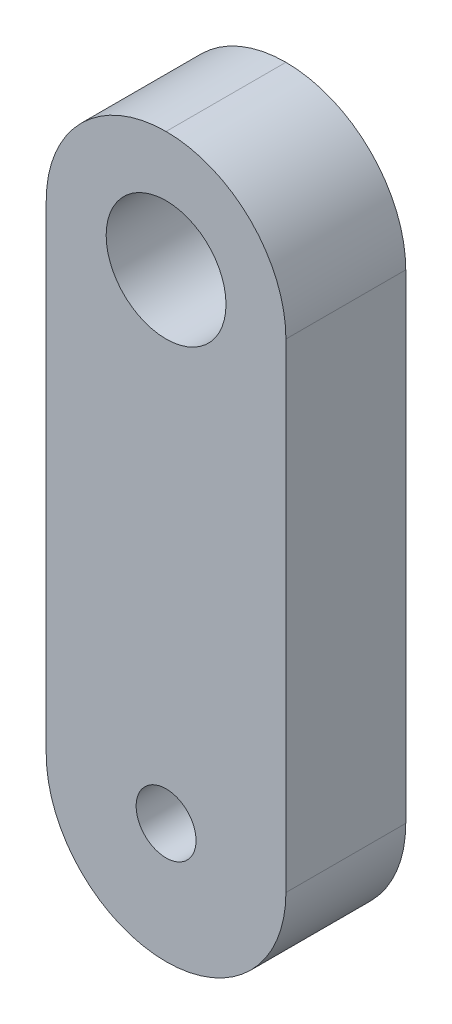
ISO-10303-21;
HEADER;
FILE_DESCRIPTION(('STEP AP214'),'2;1');
FILE_NAME('part.step','',(''),(''),'','','');
FILE_SCHEMA(('AUTOMOTIVE_DESIGN { 1 0 10303 214 1 1 1 1 }'));
ENDSEC;
DATA;
#1=APPLICATION_CONTEXT('core data for automotive mechanical design processes');
#2=APPLICATION_PROTOCOL_DEFINITION('international standard','automotive_design',2000,#1);
#3=PRODUCT_CONTEXT('',#1,'mechanical');
#4=PRODUCT('Part','Part','',(#3));
#5=PRODUCT_RELATED_PRODUCT_CATEGORY('part','',(#4));
#6=PRODUCT_DEFINITION_FORMATION('','',#4);
#7=PRODUCT_DEFINITION_CONTEXT('part definition',#1,'design');
#8=PRODUCT_DEFINITION('design','',#6,#7);
#9=PRODUCT_DEFINITION_SHAPE('','',#8);
#10=(LENGTH_UNIT() NAMED_UNIT(*) SI_UNIT(.MILLI.,.METRE.));
#11=(NAMED_UNIT(*) PLANE_ANGLE_UNIT() SI_UNIT($,.RADIAN.));
#12=(NAMED_UNIT(*) SI_UNIT($,.STERADIAN.) SOLID_ANGLE_UNIT());
#13=UNCERTAINTY_MEASURE_WITH_UNIT(LENGTH_MEASURE(1.E-05),#10,'distance_accuracy_value','');
#14=(GEOMETRIC_REPRESENTATION_CONTEXT(3) GLOBAL_UNCERTAINTY_ASSIGNED_CONTEXT((#13)) GLOBAL_UNIT_ASSIGNED_CONTEXT((#10,
#11,#12)) REPRESENTATION_CONTEXT('',''));
#15=CARTESIAN_POINT('',(0.,0.,0.));
#16=DIRECTION('',(0.,0.,1.));
#17=DIRECTION('',(1.,0.,0.));
#18=AXIS2_PLACEMENT_3D('',#15,#16,#17);
#19=CARTESIAN_POINT('',(0.,0.,10.));
#20=DIRECTION('',(1.,0.,0.));
#21=DIRECTION('',(0.,0.,-1.));
#22=AXIS2_PLACEMENT_3D('',#19,#20,#21);
#23=PLANE('',#22);
#24=DIRECTION('',(0.,-1.,0.));
#25=VECTOR('',#24,1.);
#26=CARTESIAN_POINT('',(0.,0.,0.));
#27=LINE('',#26,#25);
#28=CARTESIAN_POINT('',(0.,50.,0.));
#29=VERTEX_POINT('',#28);
#30=CARTESIAN_POINT('',(0.,10.,0.));
#31=VERTEX_POINT('',#30);
#32=EDGE_CURVE('E103',#29,#31,#27,.T.);
#33=ORIENTED_EDGE('',*,*,#32,.T.);
#34=DIRECTION('',(0.,0.,-1.));
#35=VECTOR('',#34,1.);
#36=CARTESIAN_POINT('',(0.,10.,10.));
#37=LINE('',#36,#35);
#38=CARTESIAN_POINT('',(0.,10.,10.));
#39=VERTEX_POINT('',#38);
#40=EDGE_CURVE('E107',#31,#39,#37,.F.);
#41=ORIENTED_EDGE('',*,*,#40,.T.);
#42=DIRECTION('',(0.,-1.,0.));
#43=VECTOR('',#42,1.);
#44=CARTESIAN_POINT('',(0.,0.,10.));
#45=LINE('',#44,#43);
#46=CARTESIAN_POINT('',(0.,50.,10.));
#47=VERTEX_POINT('',#46);
#48=EDGE_CURVE('E106',#47,#39,#45,.T.);
#49=ORIENTED_EDGE('',*,*,#48,.F.);
#50=DIRECTION('',(0.,0.,-1.));
#51=VECTOR('',#50,1.);
#52=CARTESIAN_POINT('',(0.,50.,10.));
#53=LINE('',#52,#51);
#54=EDGE_CURVE('E92',#47,#29,#53,.T.);
#55=ORIENTED_EDGE('',*,*,#54,.T.);
#56=EDGE_LOOP('',(#33,#41,#49,#55));
#57=FACE_BOUND('',#56,.T.);
#58=ADVANCED_FACE('F33',(#57),#23,.F.);
#59=CARTESIAN_POINT('',(20.,0.,10.));
#60=DIRECTION('',(-1.,0.,0.));
#61=DIRECTION('',(0.,0.,1.));
#62=AXIS2_PLACEMENT_3D('',#59,#60,#61);
#63=PLANE('',#62);
#64=DIRECTION('',(0.,1.,0.));
#65=VECTOR('',#64,1.);
#66=CARTESIAN_POINT('',(20.,0.,10.));
#67=LINE('',#66,#65);
#68=CARTESIAN_POINT('',(20.,10.,10.));
#69=VERTEX_POINT('',#68);
#70=CARTESIAN_POINT('',(20.,50.,10.));
#71=VERTEX_POINT('',#70);
#72=EDGE_CURVE('E120',#69,#71,#67,.T.);
#73=ORIENTED_EDGE('',*,*,#72,.F.);
#74=DIRECTION('',(0.,0.,-1.));
#75=VECTOR('',#74,1.);
#76=CARTESIAN_POINT('',(20.,10.,10.));
#77=LINE('',#76,#75);
#78=CARTESIAN_POINT('',(20.,10.,0.));
#79=VERTEX_POINT('',#78);
#80=EDGE_CURVE('E11',#69,#79,#77,.T.);
#81=ORIENTED_EDGE('',*,*,#80,.T.);
#82=DIRECTION('',(0.,1.,0.));
#83=VECTOR('',#82,1.);
#84=CARTESIAN_POINT('',(20.,0.,0.));
#85=LINE('',#84,#83);
#86=CARTESIAN_POINT('',(20.,50.,0.));
#87=VERTEX_POINT('',#86);
#88=EDGE_CURVE('E112',#79,#87,#85,.T.);
#89=ORIENTED_EDGE('',*,*,#88,.T.);
#90=DIRECTION('',(0.,0.,-1.));
#91=VECTOR('',#90,1.);
#92=CARTESIAN_POINT('',(20.,50.,10.));
#93=LINE('',#92,#91);
#94=EDGE_CURVE('E42',#87,#71,#93,.F.);
#95=ORIENTED_EDGE('',*,*,#94,.T.);
#96=EDGE_LOOP('',(#73,#81,#89,#95));
#97=FACE_BOUND('',#96,.T.);
#98=ADVANCED_FACE('F154',(#97),#63,.F.);
#99=CARTESIAN_POINT('',(0.,0.,10.));
#100=DIRECTION('',(0.,0.,-1.));
#101=DIRECTION('',(-1.,0.,0.));
#102=AXIS2_PLACEMENT_3D('',#99,#100,#101);
#103=PLANE('',#102);
#104=CARTESIAN_POINT('',(10.,50.,10.));
#105=DIRECTION('',(0.,0.,-1.));
#106=DIRECTION('',(-1.,0.,0.));
#107=AXIS2_PLACEMENT_3D('',#104,#105,#106);
#108=CIRCLE('',#107,5.);
#109=CARTESIAN_POINT('',(5.00000000000001,50.,10.));
#110=VERTEX_POINT('',#109);
#111=EDGE_CURVE('E113',#110,#110,#108,.T.);
#112=ORIENTED_EDGE('',*,*,#111,.T.);
#113=EDGE_LOOP('',(#112));
#114=FACE_BOUND('',#113,.T.);
#115=CARTESIAN_POINT('',(10.,10.,10.));
#116=DIRECTION('',(0.,0.,-1.));
#117=DIRECTION('',(-1.,0.,0.));
#118=AXIS2_PLACEMENT_3D('',#115,#116,#117);
#119=CIRCLE('',#118,2.5);
#120=CARTESIAN_POINT('',(7.50000000000001,10.,10.));
#121=VERTEX_POINT('',#120);
#122=EDGE_CURVE('E117',#121,#121,#119,.T.);
#123=ORIENTED_EDGE('',*,*,#122,.T.);
#124=EDGE_LOOP('',(#123));
#125=FACE_BOUND('',#124,.T.);
#126=ORIENTED_EDGE('',*,*,#48,.T.);
#127=CARTESIAN_POINT('',(10.,10.,10.));
#128=DIRECTION('',(0.,0.,-1.));
#129=DIRECTION('',(-1.,0.,0.));
#130=AXIS2_PLACEMENT_3D('',#127,#128,#129);
#131=CIRCLE('',#130,10.);
#132=CARTESIAN_POINT('',(10.,0.,10.));
#133=VERTEX_POINT('',#132);
#134=EDGE_CURVE('E132',#39,#133,#131,.F.);
#135=ORIENTED_EDGE('',*,*,#134,.T.);
#136=CARTESIAN_POINT('',(10.,10.,10.));
#137=DIRECTION('',(0.,0.,-1.));
#138=DIRECTION('',(-1.,0.,0.));
#139=AXIS2_PLACEMENT_3D('',#136,#137,#138);
#140=CIRCLE('',#139,10.);
#141=EDGE_CURVE('E130',#133,#69,#140,.F.);
#142=ORIENTED_EDGE('',*,*,#141,.T.);
#143=ORIENTED_EDGE('',*,*,#72,.T.);
#144=CARTESIAN_POINT('',(10.,50.,10.));
#145=DIRECTION('',(0.,0.,-1.));
#146=DIRECTION('',(-1.,0.,0.));
#147=AXIS2_PLACEMENT_3D('',#144,#145,#146);
#148=CIRCLE('',#147,10.);
#149=CARTESIAN_POINT('',(10.,60.,10.));
#150=VERTEX_POINT('',#149);
#151=EDGE_CURVE('E50',#71,#150,#148,.F.);
#152=ORIENTED_EDGE('',*,*,#151,.T.);
#153=CARTESIAN_POINT('',(10.,50.,10.));
#154=DIRECTION('',(0.,0.,-1.));
#155=DIRECTION('',(-1.,0.,0.));
#156=AXIS2_PLACEMENT_3D('',#153,#154,#155);
#157=CIRCLE('',#156,10.);
#158=EDGE_CURVE('E128',#150,#47,#157,.F.);
#159=ORIENTED_EDGE('',*,*,#158,.T.);
#160=EDGE_LOOP('',(#126,#135,#142,#143,#152,#159));
#161=FACE_BOUND('',#160,.T.);
#162=ADVANCED_FACE('F148',(#114,#125,#161),#103,.F.);
#163=CARTESIAN_POINT('',(0.,0.,0.));
#164=DIRECTION('',(0.,0.,-1.));
#165=DIRECTION('',(-1.,0.,0.));
#166=AXIS2_PLACEMENT_3D('',#163,#164,#165);
#167=PLANE('',#166);
#168=CARTESIAN_POINT('',(10.,50.,0.));
#169=DIRECTION('',(0.,0.,1.));
#170=DIRECTION('',(1.,0.,0.));
#171=AXIS2_PLACEMENT_3D('',#168,#169,#170);
#172=CIRCLE('',#171,5.);
#173=CARTESIAN_POINT('',(15.,50.,0.));
#174=VERTEX_POINT('',#173);
#175=EDGE_CURVE('E140',#174,#174,#172,.T.);
#176=ORIENTED_EDGE('',*,*,#175,.T.);
#177=EDGE_LOOP('',(#176));
#178=FACE_BOUND('',#177,.T.);
#179=CARTESIAN_POINT('',(10.,10.,0.));
#180=DIRECTION('',(0.,0.,1.));
#181=DIRECTION('',(1.,0.,0.));
#182=AXIS2_PLACEMENT_3D('',#179,#180,#181);
#183=CIRCLE('',#182,2.5);
#184=CARTESIAN_POINT('',(12.5,10.,0.));
#185=VERTEX_POINT('',#184);
#186=EDGE_CURVE('E136',#185,#185,#183,.T.);
#187=ORIENTED_EDGE('',*,*,#186,.T.);
#188=EDGE_LOOP('',(#187));
#189=FACE_BOUND('',#188,.T.);
#190=CARTESIAN_POINT('',(10.,10.,0.));
#191=DIRECTION('',(0.,0.,-1.));
#192=DIRECTION('',(-1.,0.,0.));
#193=AXIS2_PLACEMENT_3D('',#190,#191,#192);
#194=CIRCLE('',#193,10.);
#195=CARTESIAN_POINT('',(10.,0.,0.));
#196=VERTEX_POINT('',#195);
#197=EDGE_CURVE('E96',#79,#196,#194,.T.);
#198=ORIENTED_EDGE('',*,*,#197,.T.);
#199=CARTESIAN_POINT('',(10.,10.,0.));
#200=DIRECTION('',(0.,0.,-1.));
#201=DIRECTION('',(-1.,0.,0.));
#202=AXIS2_PLACEMENT_3D('',#199,#200,#201);
#203=CIRCLE('',#202,10.);
#204=EDGE_CURVE('E108',#196,#31,#203,.T.);
#205=ORIENTED_EDGE('',*,*,#204,.T.);
#206=ORIENTED_EDGE('',*,*,#32,.F.);
#207=CARTESIAN_POINT('',(10.,50.,0.));
#208=DIRECTION('',(0.,0.,-1.));
#209=DIRECTION('',(-1.,0.,0.));
#210=AXIS2_PLACEMENT_3D('',#207,#208,#209);
#211=CIRCLE('',#210,10.);
#212=CARTESIAN_POINT('',(10.,60.,0.));
#213=VERTEX_POINT('',#212);
#214=EDGE_CURVE('E88',#29,#213,#211,.T.);
#215=ORIENTED_EDGE('',*,*,#214,.T.);
#216=CARTESIAN_POINT('',(10.,50.,0.));
#217=DIRECTION('',(0.,0.,-1.));
#218=DIRECTION('',(-1.,0.,0.));
#219=AXIS2_PLACEMENT_3D('',#216,#217,#218);
#220=CIRCLE('',#219,10.);
#221=EDGE_CURVE('E97',#213,#87,#220,.T.);
#222=ORIENTED_EDGE('',*,*,#221,.T.);
#223=ORIENTED_EDGE('',*,*,#88,.F.);
#224=EDGE_LOOP('',(#198,#205,#206,#215,#222,#223));
#225=FACE_BOUND('',#224,.T.);
#226=ADVANCED_FACE('F110',(#178,#189,#225),#167,.T.);
#227=CARTESIAN_POINT('',(10.,10.,0.));
#228=DIRECTION('',(0.,0.,1.));
#229=DIRECTION('',(1.,0.,0.));
#230=AXIS2_PLACEMENT_3D('',#227,#228,#229);
#231=CYLINDRICAL_SURFACE('',#230,2.5);
#232=ORIENTED_EDGE('',*,*,#186,.F.);
#233=EDGE_LOOP('',(#232));
#234=FACE_BOUND('',#233,.T.);
#235=ORIENTED_EDGE('',*,*,#122,.F.);
#236=EDGE_LOOP('',(#235));
#237=FACE_BOUND('',#236,.T.);
#238=ADVANCED_FACE('F175',(#234,#237),#231,.F.);
#239=CARTESIAN_POINT('',(10.,50.,0.));
#240=DIRECTION('',(0.,0.,1.));
#241=DIRECTION('',(1.,0.,0.));
#242=AXIS2_PLACEMENT_3D('',#239,#240,#241);
#243=CYLINDRICAL_SURFACE('',#242,5.);
#244=ORIENTED_EDGE('',*,*,#175,.F.);
#245=EDGE_LOOP('',(#244));
#246=FACE_BOUND('',#245,.T.);
#247=ORIENTED_EDGE('',*,*,#111,.F.);
#248=EDGE_LOOP('',(#247));
#249=FACE_BOUND('',#248,.T.);
#250=ADVANCED_FACE('F164',(#246,#249),#243,.F.);
#251=CARTESIAN_POINT('',(10.,10.,10.));
#252=DIRECTION('',(0.,0.,-1.));
#253=DIRECTION('',(-1.,0.,0.));
#254=AXIS2_PLACEMENT_3D('',#251,#252,#253);
#255=CYLINDRICAL_SURFACE('',#254,10.);
#256=ORIENTED_EDGE('',*,*,#80,.F.);
#257=ORIENTED_EDGE('',*,*,#141,.F.);
#258=DIRECTION('',(0.,0.,-1.));
#259=VECTOR('',#258,1.);
#260=CARTESIAN_POINT('',(10.,0.,10.));
#261=LINE('',#260,#259);
#262=EDGE_CURVE('E134',#196,#133,#261,.F.);
#263=ORIENTED_EDGE('',*,*,#262,.F.);
#264=ORIENTED_EDGE('',*,*,#197,.F.);
#265=EDGE_LOOP('',(#256,#257,#263,#264));
#266=FACE_BOUND('',#265,.T.);
#267=ADVANCED_FACE('F156',(#266),#255,.T.);
#268=CARTESIAN_POINT('',(10.,10.,10.));
#269=DIRECTION('',(0.,0.,-1.));
#270=DIRECTION('',(-1.,0.,0.));
#271=AXIS2_PLACEMENT_3D('',#268,#269,#270);
#272=CYLINDRICAL_SURFACE('',#271,10.);
#273=ORIENTED_EDGE('',*,*,#134,.F.);
#274=ORIENTED_EDGE('',*,*,#40,.F.);
#275=ORIENTED_EDGE('',*,*,#204,.F.);
#276=ORIENTED_EDGE('',*,*,#262,.T.);
#277=EDGE_LOOP('',(#273,#274,#275,#276));
#278=FACE_BOUND('',#277,.T.);
#279=ADVANCED_FACE('F157',(#278),#272,.T.);
#280=CARTESIAN_POINT('',(10.,50.,10.));
#281=DIRECTION('',(0.,0.,-1.));
#282=DIRECTION('',(-1.,0.,0.));
#283=AXIS2_PLACEMENT_3D('',#280,#281,#282);
#284=CYLINDRICAL_SURFACE('',#283,10.);
#285=DIRECTION('',(0.,0.,-1.));
#286=VECTOR('',#285,1.);
#287=CARTESIAN_POINT('',(10.,60.,10.));
#288=LINE('',#287,#286);
#289=EDGE_CURVE('E37',#150,#213,#288,.T.);
#290=ORIENTED_EDGE('',*,*,#289,.F.);
#291=ORIENTED_EDGE('',*,*,#151,.F.);
#292=ORIENTED_EDGE('',*,*,#94,.F.);
#293=ORIENTED_EDGE('',*,*,#221,.F.);
#294=EDGE_LOOP('',(#290,#291,#292,#293));
#295=FACE_BOUND('',#294,.T.);
#296=ADVANCED_FACE('F35',(#295),#284,.T.);
#297=CARTESIAN_POINT('',(10.,50.,10.));
#298=DIRECTION('',(0.,0.,-1.));
#299=DIRECTION('',(-1.,0.,0.));
#300=AXIS2_PLACEMENT_3D('',#297,#298,#299);
#301=CYLINDRICAL_SURFACE('',#300,10.);
#302=ORIENTED_EDGE('',*,*,#158,.F.);
#303=ORIENTED_EDGE('',*,*,#289,.T.);
#304=ORIENTED_EDGE('',*,*,#214,.F.);
#305=ORIENTED_EDGE('',*,*,#54,.F.);
#306=EDGE_LOOP('',(#302,#303,#304,#305));
#307=FACE_BOUND('',#306,.T.);
#308=ADVANCED_FACE('F91',(#307),#301,.T.);
#309=CLOSED_SHELL('',(#58,#98,#162,#226,#238,#250,#267,#279,#296,#308));
#310=MANIFOLD_SOLID_BREP('B2',#309);
#311=ADVANCED_BREP_SHAPE_REPRESENTATION('',(#18,#310),#14);
#312=SHAPE_DEFINITION_REPRESENTATION(#9,#311);
ENDSEC;
END-ISO-10303-21;
